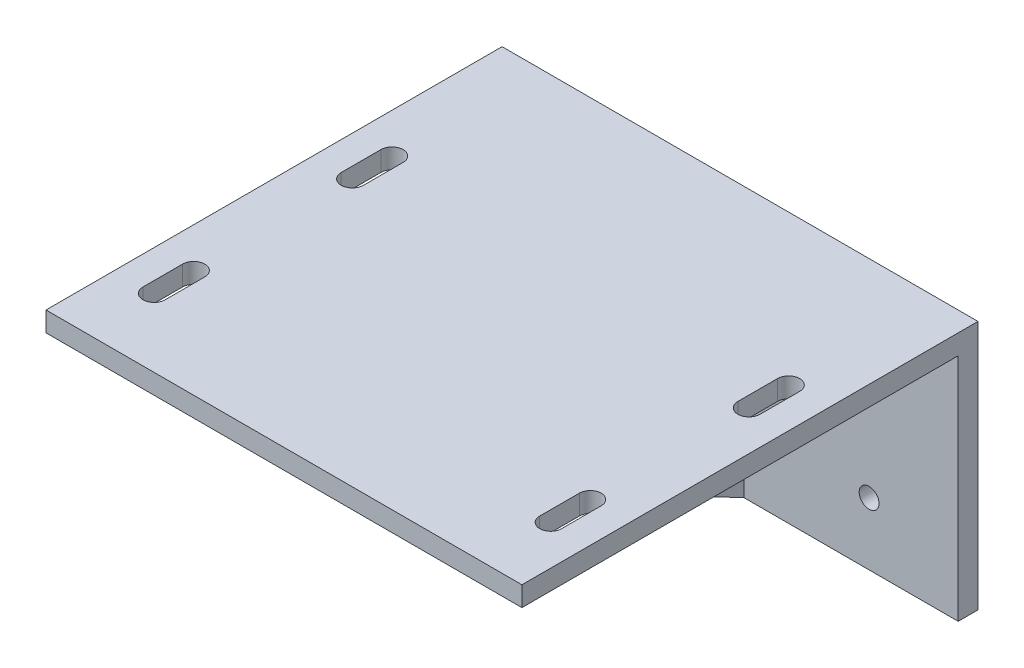
ISO-10303-21;
HEADER;
FILE_DESCRIPTION(('STEP AP214'),'2;1');
FILE_NAME('part.step','',(''),(''),'','','');
FILE_SCHEMA(('AUTOMOTIVE_DESIGN { 1 0 10303 214 1 1 1 1 }'));
ENDSEC;
DATA;
#1=APPLICATION_CONTEXT('core data for automotive mechanical design processes');
#2=APPLICATION_PROTOCOL_DEFINITION('international standard','automotive_design',2000,#1);
#3=PRODUCT_CONTEXT('',#1,'mechanical');
#4=PRODUCT('Part','Part','',(#3));
#5=PRODUCT_RELATED_PRODUCT_CATEGORY('part','',(#4));
#6=PRODUCT_DEFINITION_FORMATION('','',#4);
#7=PRODUCT_DEFINITION_CONTEXT('part definition',#1,'design');
#8=PRODUCT_DEFINITION('design','',#6,#7);
#9=PRODUCT_DEFINITION_SHAPE('','',#8);
#10=(LENGTH_UNIT() NAMED_UNIT(*) SI_UNIT(.MILLI.,.METRE.));
#11=(NAMED_UNIT(*) PLANE_ANGLE_UNIT() SI_UNIT($,.RADIAN.));
#12=(NAMED_UNIT(*) SI_UNIT($,.STERADIAN.) SOLID_ANGLE_UNIT());
#13=UNCERTAINTY_MEASURE_WITH_UNIT(LENGTH_MEASURE(1.E-05),#10,'distance_accuracy_value','');
#14=(GEOMETRIC_REPRESENTATION_CONTEXT(3) GLOBAL_UNCERTAINTY_ASSIGNED_CONTEXT((#13)) GLOBAL_UNIT_ASSIGNED_CONTEXT((#10,
#11,#12)) REPRESENTATION_CONTEXT('',''));
#15=CARTESIAN_POINT('',(0.,0.,0.));
#16=DIRECTION('',(0.,0.,1.));
#17=DIRECTION('',(1.,0.,0.));
#18=AXIS2_PLACEMENT_3D('',#15,#16,#17);
#19=CARTESIAN_POINT('',(-20.139723183391,-57.449446366782,146.05));
#20=DIRECTION('',(1.,0.,0.));
#21=DIRECTION('',(0.,0.,-1.));
#22=AXIS2_PLACEMENT_3D('',#19,#20,#21);
#23=PLANE('',#22);
#24=DIRECTION('',(0.,-0.466359614987067,-0.884595223539623));
#25=VECTOR('',#24,1.);
#26=CARTESIAN_POINT('',(-20.139723183391,16.210553633218,146.05));
#27=LINE('',#26,#25);
#28=CARTESIAN_POINT('',(-20.139723183391,16.210553633218,146.05));
#29=VERTEX_POINT('',#28);
#30=CARTESIAN_POINT('',(-20.139723183391,-57.444446366782,6.35));
#31=VERTEX_POINT('',#30);
#32=EDGE_CURVE('E213',#29,#31,#27,.T.);
#33=ORIENTED_EDGE('',*,*,#32,.F.);
#34=DIRECTION('',(0.,0.,-1.));
#35=VECTOR('',#34,1.);
#36=CARTESIAN_POINT('',(-20.139723183391,16.210553633218,146.05));
#37=LINE('',#36,#35);
#38=CARTESIAN_POINT('',(-20.139723183391,16.210553633218,6.34999999999999));
#39=VERTEX_POINT('',#38);
#40=EDGE_CURVE('E218',#29,#39,#37,.T.);
#41=ORIENTED_EDGE('',*,*,#40,.T.);
#42=DIRECTION('',(0.,1.,0.));
#43=VECTOR('',#42,1.);
#44=CARTESIAN_POINT('',(-20.139723183391,0.,6.35));
#45=LINE('',#44,#43);
#46=EDGE_CURVE('E221',#31,#39,#45,.T.);
#47=ORIENTED_EDGE('',*,*,#46,.F.);
#48=EDGE_LOOP('',(#33,#41,#47));
#49=FACE_BOUND('',#48,.T.);
#50=ADVANCED_FACE('F50',(#49),#23,.F.);
#51=CARTESIAN_POINT('',(-88.719723183391,16.210553633218,146.05));
#52=DIRECTION('',(0.,1.,0.));
#53=DIRECTION('',(0.,0.,1.));
#54=AXIS2_PLACEMENT_3D('',#51,#52,#53);
#55=PLANE('',#54);
#56=DIRECTION('',(0.,0.,1.));
#57=VECTOR('',#56,1.);
#58=CARTESIAN_POINT('',(-79.575723183391,16.210553633218,146.05));
#59=LINE('',#58,#57);
#60=CARTESIAN_POINT('',(-79.575723183391,16.210553633218,111.449496373036));
#61=VERTEX_POINT('',#60);
#62=CARTESIAN_POINT('',(-79.575723183391,16.210553633218,124.149496373036));
#63=VERTEX_POINT('',#62);
#64=EDGE_CURVE('E370',#61,#63,#59,.T.);
#65=ORIENTED_EDGE('',*,*,#64,.T.);
#66=CARTESIAN_POINT('',(-76.019723183391,16.210553633218,124.149496373036));
#67=DIRECTION('',(0.,1.,0.));
#68=DIRECTION('',(0.,0.,1.));
#69=AXIS2_PLACEMENT_3D('',#66,#67,#68);
#70=CIRCLE('',#69,3.556);
#71=CARTESIAN_POINT('',(-72.463723183391,16.210553633218,124.149496373036));
#72=VERTEX_POINT('',#71);
#73=EDGE_CURVE('E361',#63,#72,#70,.T.);
#74=ORIENTED_EDGE('',*,*,#73,.T.);
#75=DIRECTION('',(0.,0.,-1.));
#76=VECTOR('',#75,1.);
#77=CARTESIAN_POINT('',(-72.463723183391,16.210553633218,146.05));
#78=LINE('',#77,#76);
#79=CARTESIAN_POINT('',(-72.463723183391,16.210553633218,111.449496373036));
#80=VERTEX_POINT('',#79);
#81=EDGE_CURVE('E374',#72,#80,#78,.T.);
#82=ORIENTED_EDGE('',*,*,#81,.T.);
#83=CARTESIAN_POINT('',(-76.019723183391,16.210553633218,111.449496373036));
#84=DIRECTION('',(0.,1.,0.));
#85=DIRECTION('',(0.,0.,1.));
#86=AXIS2_PLACEMENT_3D('',#83,#84,#85);
#87=CIRCLE('',#86,3.556);
#88=EDGE_CURVE('E371',#80,#61,#87,.T.);
#89=ORIENTED_EDGE('',*,*,#88,.T.);
#90=EDGE_LOOP('',(#65,#74,#82,#89));
#91=FACE_BOUND('',#90,.T.);
#92=DIRECTION('',(0.,0.,1.));
#93=VECTOR('',#92,1.);
#94=CARTESIAN_POINT('',(-79.575723183391,16.210553633218,146.05));
#95=LINE('',#94,#93);
#96=CARTESIAN_POINT('',(-79.575723183391,16.210553633218,47.9494963730361));
#97=VERTEX_POINT('',#96);
#98=CARTESIAN_POINT('',(-79.575723183391,16.210553633218,60.6494963730361));
#99=VERTEX_POINT('',#98);
#100=EDGE_CURVE('E353',#97,#99,#95,.T.);
#101=ORIENTED_EDGE('',*,*,#100,.T.);
#102=CARTESIAN_POINT('',(-76.019723183391,16.210553633218,60.6494963730361));
#103=DIRECTION('',(0.,1.,0.));
#104=DIRECTION('',(0.,0.,1.));
#105=AXIS2_PLACEMENT_3D('',#102,#103,#104);
#106=CIRCLE('',#105,3.556);
#107=CARTESIAN_POINT('',(-72.463723183391,16.210553633218,60.6494963730361));
#108=VERTEX_POINT('',#107);
#109=EDGE_CURVE('E350',#99,#108,#106,.T.);
#110=ORIENTED_EDGE('',*,*,#109,.T.);
#111=DIRECTION('',(0.,0.,-1.));
#112=VECTOR('',#111,1.);
#113=CARTESIAN_POINT('',(-72.463723183391,16.210553633218,146.05));
#114=LINE('',#113,#112);
#115=CARTESIAN_POINT('',(-72.463723183391,16.210553633218,47.9494963730361));
#116=VERTEX_POINT('',#115);
#117=EDGE_CURVE('E356',#108,#116,#114,.T.);
#118=ORIENTED_EDGE('',*,*,#117,.T.);
#119=CARTESIAN_POINT('',(-76.019723183391,16.210553633218,47.9494963730361));
#120=DIRECTION('',(0.,1.,0.));
#121=DIRECTION('',(0.,0.,1.));
#122=AXIS2_PLACEMENT_3D('',#119,#120,#121);
#123=CIRCLE('',#122,3.556);
#124=EDGE_CURVE('E352',#116,#97,#123,.T.);
#125=ORIENTED_EDGE('',*,*,#124,.T.);
#126=EDGE_LOOP('',(#101,#110,#118,#125));
#127=FACE_BOUND('',#126,.T.);
#128=ORIENTED_EDGE('',*,*,#40,.F.);
#129=DIRECTION('',(1.,0.,0.));
#130=VECTOR('',#129,1.);
#131=CARTESIAN_POINT('',(-88.719723183391,16.210553633218,146.05));
#132=LINE('',#131,#130);
#133=CARTESIAN_POINT('',(-88.719723183391,16.210553633218,146.05));
#134=VERTEX_POINT('',#133);
#135=EDGE_CURVE('E232',#134,#29,#132,.T.);
#136=ORIENTED_EDGE('',*,*,#135,.F.);
#137=DIRECTION('',(0.,0.,-1.));
#138=VECTOR('',#137,1.);
#139=CARTESIAN_POINT('',(-88.719723183391,16.210553633218,146.05));
#140=LINE('',#139,#138);
#141=CARTESIAN_POINT('',(-88.719723183391,16.210553633218,6.35));
#142=VERTEX_POINT('',#141);
#143=EDGE_CURVE('E263',#134,#142,#140,.T.);
#144=ORIENTED_EDGE('',*,*,#143,.T.);
#145=DIRECTION('',(1.,0.,0.));
#146=VECTOR('',#145,1.);
#147=CARTESIAN_POINT('',(-88.719723183391,16.210553633218,6.35));
#148=LINE('',#147,#146);
#149=EDGE_CURVE('E234',#142,#39,#148,.T.);
#150=ORIENTED_EDGE('',*,*,#149,.T.);
#151=EDGE_LOOP('',(#128,#136,#144,#150));
#152=FACE_BOUND('',#151,.T.);
#153=ADVANCED_FACE('F229',(#91,#127,#152),#55,.F.);
#154=DIRECTION('',(0.,0.,1.));
#155=VECTOR('',#154,1.);
#156=CARTESIAN_POINT('',(47.4242768166091,16.210553633218,146.05));
#157=LINE('',#156,#155);
#158=CARTESIAN_POINT('',(47.424276816609,16.210553633218,47.9494963730361));
#159=VERTEX_POINT('',#158);
#160=CARTESIAN_POINT('',(47.424276816609,16.210553633218,60.6494963730361));
#161=VERTEX_POINT('',#160);
#162=EDGE_CURVE('E333',#159,#161,#157,.T.);
#163=ORIENTED_EDGE('',*,*,#162,.T.);
#164=CARTESIAN_POINT('',(50.980276816609,16.210553633218,60.6494963730361));
#165=DIRECTION('',(0.,1.,0.));
#166=DIRECTION('',(0.,0.,1.));
#167=AXIS2_PLACEMENT_3D('',#164,#165,#166);
#168=CIRCLE('',#167,3.55599999999999);
#169=CARTESIAN_POINT('',(54.536276816609,16.210553633218,60.6494963730361));
#170=VERTEX_POINT('',#169);
#171=EDGE_CURVE('E332',#161,#170,#168,.T.);
#172=ORIENTED_EDGE('',*,*,#171,.T.);
#173=DIRECTION('',(0.,0.,-1.));
#174=VECTOR('',#173,1.);
#175=CARTESIAN_POINT('',(54.5362768166089,16.210553633218,146.05));
#176=LINE('',#175,#174);
#177=CARTESIAN_POINT('',(54.536276816609,16.210553633218,47.9494963730361));
#178=VERTEX_POINT('',#177);
#179=EDGE_CURVE('E344',#170,#178,#176,.T.);
#180=ORIENTED_EDGE('',*,*,#179,.T.);
#181=CARTESIAN_POINT('',(50.980276816609,16.210553633218,47.9494963730361));
#182=DIRECTION('',(0.,1.,0.));
#183=DIRECTION('',(0.,0.,1.));
#184=AXIS2_PLACEMENT_3D('',#181,#182,#183);
#185=CIRCLE('',#184,3.556);
#186=EDGE_CURVE('E339',#178,#159,#185,.T.);
#187=ORIENTED_EDGE('',*,*,#186,.T.);
#188=EDGE_LOOP('',(#163,#172,#180,#187));
#189=FACE_BOUND('',#188,.T.);
#190=DIRECTION('',(0.,0.,1.));
#191=VECTOR('',#190,1.);
#192=CARTESIAN_POINT('',(47.4808979164753,16.210553633218,146.05));
#193=LINE('',#192,#191);
#194=CARTESIAN_POINT('',(47.4808979164753,16.210553633218,111.449496373036));
#195=VERTEX_POINT('',#194);
#196=CARTESIAN_POINT('',(47.4808979164753,16.210553633218,124.149496373036));
#197=VERTEX_POINT('',#196);
#198=EDGE_CURVE('E317',#195,#197,#193,.T.);
#199=ORIENTED_EDGE('',*,*,#198,.T.);
#200=CARTESIAN_POINT('',(50.980276816609,16.210553633218,124.149496373036));
#201=DIRECTION('',(0.,1.,0.));
#202=DIRECTION('',(0.,0.,1.));
#203=AXIS2_PLACEMENT_3D('',#200,#201,#202);
#204=CIRCLE('',#203,3.49937890013366);
#205=CARTESIAN_POINT('',(54.4796557167427,16.210553633218,124.149496373036));
#206=VERTEX_POINT('',#205);
#207=EDGE_CURVE('E59',#197,#206,#204,.T.);
#208=ORIENTED_EDGE('',*,*,#207,.T.);
#209=DIRECTION('',(0.,0.,-1.));
#210=VECTOR('',#209,1.);
#211=CARTESIAN_POINT('',(54.4796557167427,16.210553633218,146.05));
#212=LINE('',#211,#210);
#213=CARTESIAN_POINT('',(54.4796557167427,16.210553633218,111.449496373036));
#214=VERTEX_POINT('',#213);
#215=EDGE_CURVE('E330',#206,#214,#212,.T.);
#216=ORIENTED_EDGE('',*,*,#215,.T.);
#217=CARTESIAN_POINT('',(50.980276816609,16.210553633218,111.449496373036));
#218=DIRECTION('',(0.,1.,0.));
#219=DIRECTION('',(0.,0.,1.));
#220=AXIS2_PLACEMENT_3D('',#217,#218,#219);
#221=CIRCLE('',#220,3.49937890013366);
#222=EDGE_CURVE('E323',#214,#195,#221,.T.);
#223=ORIENTED_EDGE('',*,*,#222,.T.);
#224=EDGE_LOOP('',(#199,#208,#216,#223));
#225=FACE_BOUND('',#224,.T.);
#226=DIRECTION('',(0.,0.,1.));
#227=VECTOR('',#226,1.);
#228=CARTESIAN_POINT('',(-4.89972318339101,16.210553633218,146.05));
#229=LINE('',#228,#227);
#230=CARTESIAN_POINT('',(-4.89972318339099,16.210553633218,6.34999999999999));
#231=VERTEX_POINT('',#230);
#232=CARTESIAN_POINT('',(-4.89972318339098,16.210553633218,146.05));
#233=VERTEX_POINT('',#232);
#234=EDGE_CURVE('E233',#231,#233,#229,.T.);
#235=ORIENTED_EDGE('',*,*,#234,.F.);
#236=CARTESIAN_POINT('',(63.680276816609,16.210553633218,6.35));
#237=VERTEX_POINT('',#236);
#238=EDGE_CURVE('E259',#231,#237,#148,.T.);
#239=ORIENTED_EDGE('',*,*,#238,.T.);
#240=DIRECTION('',(0.,0.,-1.));
#241=VECTOR('',#240,1.);
#242=CARTESIAN_POINT('',(63.680276816609,16.210553633218,146.05));
#243=LINE('',#242,#241);
#244=CARTESIAN_POINT('',(63.680276816609,16.210553633218,146.05));
#245=VERTEX_POINT('',#244);
#246=EDGE_CURVE('E258',#245,#237,#243,.T.);
#247=ORIENTED_EDGE('',*,*,#246,.F.);
#248=EDGE_CURVE('E244',#233,#245,#132,.T.);
#249=ORIENTED_EDGE('',*,*,#248,.F.);
#250=EDGE_LOOP('',(#235,#239,#247,#249));
#251=FACE_BOUND('',#250,.T.);
#252=ADVANCED_FACE('F634',(#189,#225,#251),#55,.F.);
#253=CARTESIAN_POINT('',(0.,0.,6.35));
#254=DIRECTION('',(0.,0.,1.));
#255=DIRECTION('',(1.,0.,0.));
#256=AXIS2_PLACEMENT_3D('',#253,#254,#255);
#257=PLANE('',#256);
#258=CARTESIAN_POINT('',(-79.1468470478863,2.56055363321799,6.35));
#259=DIRECTION('',(0.,0.,1.));
#260=DIRECTION('',(1.,0.,0.));
#261=AXIS2_PLACEMENT_3D('',#258,#259,#260);
#262=CIRCLE('',#261,3.175);
#263=CARTESIAN_POINT('',(-75.9718470478863,2.56055363321799,6.35));
#264=VERTEX_POINT('',#263);
#265=EDGE_CURVE('E292',#264,#264,#262,.T.);
#266=ORIENTED_EDGE('',*,*,#265,.F.);
#267=EDGE_LOOP('',(#266));
#268=FACE_BOUND('',#267,.T.);
#269=CARTESIAN_POINT('',(-79.1468470478863,-37.439446366782,6.35));
#270=DIRECTION('',(0.,0.,1.));
#271=DIRECTION('',(1.,0.,0.));
#272=AXIS2_PLACEMENT_3D('',#269,#270,#271);
#273=CIRCLE('',#272,3.175);
#274=CARTESIAN_POINT('',(-75.9718470478863,-37.439446366782,6.35));
#275=VERTEX_POINT('',#274);
#276=EDGE_CURVE('E281',#275,#275,#273,.T.);
#277=ORIENTED_EDGE('',*,*,#276,.F.);
#278=EDGE_LOOP('',(#277));
#279=FACE_BOUND('',#278,.T.);
#280=DIRECTION('',(1.,0.,0.));
#281=VECTOR('',#280,1.);
#282=CARTESIAN_POINT('',(-88.719723183391,-57.439446366782,6.35));
#283=LINE('',#282,#281);
#284=CARTESIAN_POINT('',(-88.719723183391,-57.439446366782,6.35));
#285=VERTEX_POINT('',#284);
#286=EDGE_CURVE('E313',#285,#31,#283,.T.);
#287=ORIENTED_EDGE('',*,*,#286,.T.);
#288=ORIENTED_EDGE('',*,*,#46,.T.);
#289=ORIENTED_EDGE('',*,*,#149,.F.);
#290=DIRECTION('',(0.,-1.,0.));
#291=VECTOR('',#290,1.);
#292=CARTESIAN_POINT('',(-88.719723183391,22.560553633218,6.35));
#293=LINE('',#292,#291);
#294=EDGE_CURVE('E299',#142,#285,#293,.T.);
#295=ORIENTED_EDGE('',*,*,#294,.T.);
#296=EDGE_LOOP('',(#287,#288,#289,#295));
#297=FACE_BOUND('',#296,.T.);
#298=ADVANCED_FACE('F418',(#268,#279,#297),#257,.T.);
#299=CARTESIAN_POINT('',(35.1531529521137,-37.439446366782,6.35));
#300=DIRECTION('',(0.,0.,1.));
#301=DIRECTION('',(1.,0.,0.));
#302=AXIS2_PLACEMENT_3D('',#299,#300,#301);
#303=CIRCLE('',#302,3.175);
#304=CARTESIAN_POINT('',(38.3281529521137,-37.439446366782,6.35));
#305=VERTEX_POINT('',#304);
#306=EDGE_CURVE('E270',#305,#305,#303,.T.);
#307=ORIENTED_EDGE('',*,*,#306,.F.);
#308=EDGE_LOOP('',(#307));
#309=FACE_BOUND('',#308,.T.);
#310=CARTESIAN_POINT('',(35.1531529521137,2.56055363321799,6.35));
#311=DIRECTION('',(0.,0.,1.));
#312=DIRECTION('',(1.,0.,0.));
#313=AXIS2_PLACEMENT_3D('',#310,#311,#312);
#314=CIRCLE('',#313,3.17500000000001);
#315=CARTESIAN_POINT('',(38.3281529521137,2.56055363321799,6.35));
#316=VERTEX_POINT('',#315);
#317=EDGE_CURVE('E274',#316,#316,#314,.T.);
#318=ORIENTED_EDGE('',*,*,#317,.F.);
#319=EDGE_LOOP('',(#318));
#320=FACE_BOUND('',#319,.T.);
#321=ORIENTED_EDGE('',*,*,#238,.F.);
#322=DIRECTION('',(0.,-1.,0.));
#323=VECTOR('',#322,1.);
#324=CARTESIAN_POINT('',(-4.89972318339099,0.,6.35));
#325=LINE('',#324,#323);
#326=CARTESIAN_POINT('',(-4.89972318339101,-57.441946366782,6.34999999999999));
#327=VERTEX_POINT('',#326);
#328=EDGE_CURVE('E535',#231,#327,#325,.T.);
#329=ORIENTED_EDGE('',*,*,#328,.T.);
#330=CARTESIAN_POINT('',(63.680301816609,-57.439446366782,6.35000000000008));
#331=VERTEX_POINT('',#330);
#332=EDGE_CURVE('E305',#327,#331,#283,.T.);
#333=ORIENTED_EDGE('',*,*,#332,.T.);
#334=DIRECTION('',(0.,1.,0.));
#335=VECTOR('',#334,1.);
#336=CARTESIAN_POINT('',(63.680276816609,22.560553633218,6.35));
#337=LINE('',#336,#335);
#338=EDGE_CURVE('E312',#331,#237,#337,.T.);
#339=ORIENTED_EDGE('',*,*,#338,.T.);
#340=EDGE_LOOP('',(#321,#329,#333,#339));
#341=FACE_BOUND('',#340,.T.);
#342=ADVANCED_FACE('F653',(#309,#320,#341),#257,.T.);
#343=CARTESIAN_POINT('',(0.,0.,0.));
#344=DIRECTION('',(0.,0.,1.));
#345=DIRECTION('',(1.,0.,0.));
#346=AXIS2_PLACEMENT_3D('',#343,#344,#345);
#347=PLANE('',#346);
#348=DIRECTION('',(0.,-1.,0.));
#349=VECTOR('',#348,1.);
#350=CARTESIAN_POINT('',(-88.719723183391,22.560553633218,0.));
#351=LINE('',#350,#349);
#352=CARTESIAN_POINT('',(-88.719723183391,22.560553633218,0.));
#353=VERTEX_POINT('',#352);
#354=CARTESIAN_POINT('',(-88.719723183391,-57.439446366782,0.));
#355=VERTEX_POINT('',#354);
#356=EDGE_CURVE('E293',#353,#355,#351,.T.);
#357=ORIENTED_EDGE('',*,*,#356,.F.);
#358=DIRECTION('',(-1.,0.,0.));
#359=VECTOR('',#358,1.);
#360=CARTESIAN_POINT('',(-88.719723183391,22.560553633218,0.));
#361=LINE('',#360,#359);
#362=CARTESIAN_POINT('',(63.680276816609,22.560553633218,0.));
#363=VERTEX_POINT('',#362);
#364=EDGE_CURVE('E304',#363,#353,#361,.T.);
#365=ORIENTED_EDGE('',*,*,#364,.F.);
#366=DIRECTION('',(0.,1.,0.));
#367=VECTOR('',#366,1.);
#368=CARTESIAN_POINT('',(63.680276816609,22.560553633218,0.));
#369=LINE('',#368,#367);
#370=CARTESIAN_POINT('',(63.680276816609,-57.439446366782,0.));
#371=VERTEX_POINT('',#370);
#372=EDGE_CURVE('E394',#371,#363,#369,.T.);
#373=ORIENTED_EDGE('',*,*,#372,.F.);
#374=DIRECTION('',(1.,0.,0.));
#375=VECTOR('',#374,1.);
#376=CARTESIAN_POINT('',(-88.719723183391,-57.439446366782,0.));
#377=LINE('',#376,#375);
#378=EDGE_CURVE('E397',#355,#371,#377,.T.);
#379=ORIENTED_EDGE('',*,*,#378,.F.);
#380=EDGE_LOOP('',(#357,#365,#373,#379));
#381=FACE_BOUND('',#380,.T.);
#382=CARTESIAN_POINT('',(-79.1468470478863,2.56055363321799,0.));
#383=DIRECTION('',(0.,0.,1.));
#384=DIRECTION('',(1.,0.,0.));
#385=AXIS2_PLACEMENT_3D('',#382,#383,#384);
#386=CIRCLE('',#385,3.175);
#387=CARTESIAN_POINT('',(-75.9718470478863,2.56055363321799,0.));
#388=VERTEX_POINT('',#387);
#389=EDGE_CURVE('E290',#388,#388,#386,.T.);
#390=ORIENTED_EDGE('',*,*,#389,.T.);
#391=EDGE_LOOP('',(#390));
#392=FACE_BOUND('',#391,.T.);
#393=CARTESIAN_POINT('',(-79.1468470478863,-37.439446366782,0.));
#394=DIRECTION('',(0.,0.,1.));
#395=DIRECTION('',(1.,0.,0.));
#396=AXIS2_PLACEMENT_3D('',#393,#394,#395);
#397=CIRCLE('',#396,3.175);
#398=CARTESIAN_POINT('',(-75.9718470478863,-37.439446366782,0.));
#399=VERTEX_POINT('',#398);
#400=EDGE_CURVE('E276',#399,#399,#397,.T.);
#401=ORIENTED_EDGE('',*,*,#400,.T.);
#402=EDGE_LOOP('',(#401));
#403=FACE_BOUND('',#402,.T.);
#404=CARTESIAN_POINT('',(35.1531529521137,2.56055363321799,0.));
#405=DIRECTION('',(0.,0.,1.));
#406=DIRECTION('',(1.,0.,0.));
#407=AXIS2_PLACEMENT_3D('',#404,#405,#406);
#408=CIRCLE('',#407,3.17500000000001);
#409=CARTESIAN_POINT('',(38.3281529521137,2.56055363321799,0.));
#410=VERTEX_POINT('',#409);
#411=EDGE_CURVE('E271',#410,#410,#408,.T.);
#412=ORIENTED_EDGE('',*,*,#411,.T.);
#413=EDGE_LOOP('',(#412));
#414=FACE_BOUND('',#413,.T.);
#415=CARTESIAN_POINT('',(35.1531529521137,-37.439446366782,0.));
#416=DIRECTION('',(0.,0.,1.));
#417=DIRECTION('',(1.,0.,0.));
#418=AXIS2_PLACEMENT_3D('',#415,#416,#417);
#419=CIRCLE('',#418,3.175);
#420=CARTESIAN_POINT('',(38.3281529521137,-37.439446366782,0.));
#421=VERTEX_POINT('',#420);
#422=EDGE_CURVE('E266',#421,#421,#419,.T.);
#423=ORIENTED_EDGE('',*,*,#422,.T.);
#424=EDGE_LOOP('',(#423));
#425=FACE_BOUND('',#424,.T.);
#426=ADVANCED_FACE('F409',(#381,#392,#403,#414,#425),#347,.F.);
#427=CARTESIAN_POINT('',(-88.719723183391,22.560553633218,6.35));
#428=DIRECTION('',(1.,0.,0.));
#429=DIRECTION('',(0.,0.,-1.));
#430=AXIS2_PLACEMENT_3D('',#427,#428,#429);
#431=PLANE('',#430);
#432=ORIENTED_EDGE('',*,*,#356,.T.);
#433=DIRECTION('',(0.,0.,-1.));
#434=VECTOR('',#433,1.);
#435=CARTESIAN_POINT('',(-88.719723183391,-57.439446366782,6.35));
#436=LINE('',#435,#434);
#437=EDGE_CURVE('E377',#285,#355,#436,.T.);
#438=ORIENTED_EDGE('',*,*,#437,.F.);
#439=ORIENTED_EDGE('',*,*,#294,.F.);
#440=ORIENTED_EDGE('',*,*,#143,.F.);
#441=DIRECTION('',(0.,-1.,0.));
#442=VECTOR('',#441,1.);
#443=CARTESIAN_POINT('',(-88.719723183391,22.560553633218,146.05));
#444=LINE('',#443,#442);
#445=CARTESIAN_POINT('',(-88.719723183391,22.560553633218,146.05));
#446=VERTEX_POINT('',#445);
#447=EDGE_CURVE('E238',#446,#134,#444,.T.);
#448=ORIENTED_EDGE('',*,*,#447,.F.);
#449=DIRECTION('',(0.,0.,-1.));
#450=VECTOR('',#449,1.);
#451=CARTESIAN_POINT('',(-88.719723183391,22.560553633218,6.35));
#452=LINE('',#451,#450);
#453=EDGE_CURVE('E389',#446,#353,#452,.T.);
#454=ORIENTED_EDGE('',*,*,#453,.T.);
#455=EDGE_LOOP('',(#432,#438,#439,#440,#448,#454));
#456=FACE_BOUND('',#455,.T.);
#457=ADVANCED_FACE('F47',(#456),#431,.F.);
#458=CARTESIAN_POINT('',(-88.719723183391,-57.439446366782,6.35));
#459=DIRECTION('',(0.,1.,0.));
#460=DIRECTION('',(0.,0.,1.));
#461=AXIS2_PLACEMENT_3D('',#458,#459,#460);
#462=PLANE('',#461);
#463=CARTESIAN_POINT('',(-20.139723183391,-57.439446366782,6.34999999999997));
#464=DIRECTION('',(1.,0.,0.));
#465=VECTOR('',#464,1.);
#466=LINE('',#463,#465);
#467=EDGE_CURVE('E67',#31,#327,#466,.T.);
#468=ORIENTED_EDGE('',*,*,#467,.F.);
#469=ORIENTED_EDGE('',*,*,#286,.F.);
#470=ORIENTED_EDGE('',*,*,#437,.T.);
#471=ORIENTED_EDGE('',*,*,#378,.T.);
#472=DIRECTION('',(0.,0.,-1.));
#473=VECTOR('',#472,1.);
#474=CARTESIAN_POINT('',(63.680276816609,-57.439446366782,6.35));
#475=LINE('',#474,#473);
#476=EDGE_CURVE('E382',#331,#371,#475,.T.);
#477=ORIENTED_EDGE('',*,*,#476,.F.);
#478=ORIENTED_EDGE('',*,*,#332,.F.);
#479=EDGE_LOOP('',(#468,#469,#470,#471,#477,#478));
#480=FACE_BOUND('',#479,.T.);
#481=ADVANCED_FACE('F414',(#480),#462,.F.);
#482=CARTESIAN_POINT('',(63.680276816609,22.560553633218,6.35));
#483=DIRECTION('',(-1.,0.,0.));
#484=DIRECTION('',(0.,0.,1.));
#485=AXIS2_PLACEMENT_3D('',#482,#483,#484);
#486=PLANE('',#485);
#487=ORIENTED_EDGE('',*,*,#372,.T.);
#488=DIRECTION('',(0.,0.,-1.));
#489=VECTOR('',#488,1.);
#490=CARTESIAN_POINT('',(63.680276816609,22.560553633218,6.35));
#491=LINE('',#490,#489);
#492=CARTESIAN_POINT('',(63.680276816609,22.560553633218,146.05));
#493=VERTEX_POINT('',#492);
#494=EDGE_CURVE('E383',#493,#363,#491,.T.);
#495=ORIENTED_EDGE('',*,*,#494,.F.);
#496=DIRECTION('',(0.,1.,0.));
#497=VECTOR('',#496,1.);
#498=CARTESIAN_POINT('',(63.680276816609,22.560553633218,146.05));
#499=LINE('',#498,#497);
#500=EDGE_CURVE('E241',#245,#493,#499,.T.);
#501=ORIENTED_EDGE('',*,*,#500,.F.);
#502=ORIENTED_EDGE('',*,*,#246,.T.);
#503=ORIENTED_EDGE('',*,*,#338,.F.);
#504=ORIENTED_EDGE('',*,*,#476,.T.);
#505=EDGE_LOOP('',(#487,#495,#501,#502,#503,#504));
#506=FACE_BOUND('',#505,.T.);
#507=ADVANCED_FACE('F658',(#506),#486,.F.);
#508=CARTESIAN_POINT('',(-88.719723183391,22.560553633218,6.35));
#509=DIRECTION('',(0.,-1.,0.));
#510=DIRECTION('',(0.,0.,-1.));
#511=AXIS2_PLACEMENT_3D('',#508,#509,#510);
#512=PLANE('',#511);
#513=DIRECTION('',(0.,0.,-1.));
#514=VECTOR('',#513,1.);
#515=CARTESIAN_POINT('',(54.4796557167427,22.560553633218,124.149496373036));
#516=LINE('',#515,#514);
#517=CARTESIAN_POINT('',(54.4796557167427,22.560553633218,124.149496373036));
#518=VERTEX_POINT('',#517);
#519=CARTESIAN_POINT('',(54.4796557167427,22.560553633218,111.449496373036));
#520=VERTEX_POINT('',#519);
#521=EDGE_CURVE('E502',#518,#520,#516,.T.);
#522=ORIENTED_EDGE('',*,*,#521,.F.);
#523=CARTESIAN_POINT('',(50.980276816609,22.560553633218,124.149496373036));
#524=DIRECTION('',(0.,1.,0.));
#525=DIRECTION('',(0.,0.,1.));
#526=AXIS2_PLACEMENT_3D('',#523,#524,#525);
#527=CIRCLE('',#526,3.49937890013366);
#528=CARTESIAN_POINT('',(47.4808979164753,22.560553633218,124.149496373036));
#529=VERTEX_POINT('',#528);
#530=EDGE_CURVE('E505',#529,#518,#527,.T.);
#531=ORIENTED_EDGE('',*,*,#530,.F.);
#532=DIRECTION('',(0.,0.,1.));
#533=VECTOR('',#532,1.);
#534=CARTESIAN_POINT('',(47.4808979164753,22.560553633218,124.149496373036));
#535=LINE('',#534,#533);
#536=CARTESIAN_POINT('',(47.4808979164753,22.560553633218,111.449496373036));
#537=VERTEX_POINT('',#536);
#538=EDGE_CURVE('E511',#537,#529,#535,.T.);
#539=ORIENTED_EDGE('',*,*,#538,.F.);
#540=CARTESIAN_POINT('',(50.980276816609,22.560553633218,111.449496373036));
#541=DIRECTION('',(0.,1.,0.));
#542=DIRECTION('',(0.,0.,1.));
#543=AXIS2_PLACEMENT_3D('',#540,#541,#542);
#544=CIRCLE('',#543,3.49937890013366);
#545=EDGE_CURVE('E506',#520,#537,#544,.T.);
#546=ORIENTED_EDGE('',*,*,#545,.F.);
#547=EDGE_LOOP('',(#522,#531,#539,#546));
#548=FACE_BOUND('',#547,.T.);
#549=DIRECTION('',(0.,0.,-1.));
#550=VECTOR('',#549,1.);
#551=CARTESIAN_POINT('',(54.536276816609,22.560553633218,60.6494963730361));
#552=LINE('',#551,#550);
#553=CARTESIAN_POINT('',(54.536276816609,22.560553633218,60.6494963730361));
#554=VERTEX_POINT('',#553);
#555=CARTESIAN_POINT('',(54.536276816609,22.560553633218,47.9494963730361));
#556=VERTEX_POINT('',#555);
#557=EDGE_CURVE('E480',#554,#556,#552,.T.);
#558=ORIENTED_EDGE('',*,*,#557,.F.);
#559=CARTESIAN_POINT('',(50.980276816609,22.560553633218,60.6494963730361));
#560=DIRECTION('',(0.,1.,0.));
#561=DIRECTION('',(0.,0.,1.));
#562=AXIS2_PLACEMENT_3D('',#559,#560,#561);
#563=CIRCLE('',#562,3.55599999999999);
#564=CARTESIAN_POINT('',(47.424276816609,22.560553633218,60.6494963730361));
#565=VERTEX_POINT('',#564);
#566=EDGE_CURVE('E475',#565,#554,#563,.T.);
#567=ORIENTED_EDGE('',*,*,#566,.F.);
#568=DIRECTION('',(0.,0.,1.));
#569=VECTOR('',#568,1.);
#570=CARTESIAN_POINT('',(47.424276816609,22.560553633218,60.6494963730361));
#571=LINE('',#570,#569);
#572=CARTESIAN_POINT('',(47.424276816609,22.560553633218,47.9494963730361));
#573=VERTEX_POINT('',#572);
#574=EDGE_CURVE('E484',#573,#565,#571,.T.);
#575=ORIENTED_EDGE('',*,*,#574,.F.);
#576=CARTESIAN_POINT('',(50.980276816609,22.560553633218,47.9494963730361));
#577=DIRECTION('',(0.,1.,0.));
#578=DIRECTION('',(0.,0.,1.));
#579=AXIS2_PLACEMENT_3D('',#576,#577,#578);
#580=CIRCLE('',#579,3.556);
#581=EDGE_CURVE('E481',#556,#573,#580,.T.);
#582=ORIENTED_EDGE('',*,*,#581,.F.);
#583=EDGE_LOOP('',(#558,#567,#575,#582));
#584=FACE_BOUND('',#583,.T.);
#585=DIRECTION('',(0.,0.,-1.));
#586=VECTOR('',#585,1.);
#587=CARTESIAN_POINT('',(-72.463723183391,22.560553633218,60.6494963730361));
#588=LINE('',#587,#586);
#589=CARTESIAN_POINT('',(-72.463723183391,22.560553633218,60.6494963730361));
#590=VERTEX_POINT('',#589);
#591=CARTESIAN_POINT('',(-72.463723183391,22.560553633218,47.9494963730361));
#592=VERTEX_POINT('',#591);
#593=EDGE_CURVE('E449',#590,#592,#588,.T.);
#594=ORIENTED_EDGE('',*,*,#593,.F.);
#595=CARTESIAN_POINT('',(-76.019723183391,22.560553633218,60.6494963730361));
#596=DIRECTION('',(0.,1.,0.));
#597=DIRECTION('',(0.,0.,1.));
#598=AXIS2_PLACEMENT_3D('',#595,#596,#597);
#599=CIRCLE('',#598,3.556);
#600=CARTESIAN_POINT('',(-79.575723183391,22.560553633218,60.6494963730361));
#601=VERTEX_POINT('',#600);
#602=EDGE_CURVE('E448',#601,#590,#599,.T.);
#603=ORIENTED_EDGE('',*,*,#602,.F.);
#604=DIRECTION('',(0.,0.,1.));
#605=VECTOR('',#604,1.);
#606=CARTESIAN_POINT('',(-79.575723183391,22.560553633218,60.6494963730361));
#607=LINE('',#606,#605);
#608=CARTESIAN_POINT('',(-79.575723183391,22.560553633218,47.9494963730361));
#609=VERTEX_POINT('',#608);
#610=EDGE_CURVE('E460',#609,#601,#607,.T.);
#611=ORIENTED_EDGE('',*,*,#610,.F.);
#612=CARTESIAN_POINT('',(-76.019723183391,22.560553633218,47.9494963730361));
#613=DIRECTION('',(0.,1.,0.));
#614=DIRECTION('',(0.,0.,1.));
#615=AXIS2_PLACEMENT_3D('',#612,#613,#614);
#616=CIRCLE('',#615,3.556);
#617=EDGE_CURVE('E454',#592,#609,#616,.T.);
#618=ORIENTED_EDGE('',*,*,#617,.F.);
#619=EDGE_LOOP('',(#594,#603,#611,#618));
#620=FACE_BOUND('',#619,.T.);
#621=DIRECTION('',(0.,0.,-1.));
#622=VECTOR('',#621,1.);
#623=CARTESIAN_POINT('',(-72.463723183391,22.560553633218,124.149496373036));
#624=LINE('',#623,#622);
#625=CARTESIAN_POINT('',(-72.463723183391,22.560553633218,124.149496373036));
#626=VERTEX_POINT('',#625);
#627=CARTESIAN_POINT('',(-72.463723183391,22.560553633218,111.449496373036));
#628=VERTEX_POINT('',#627);
#629=EDGE_CURVE('E438',#626,#628,#624,.T.);
#630=ORIENTED_EDGE('',*,*,#629,.F.);
#631=CARTESIAN_POINT('',(-76.019723183391,22.560553633218,124.149496373036));
#632=DIRECTION('',(0.,1.,0.));
#633=DIRECTION('',(0.,0.,1.));
#634=AXIS2_PLACEMENT_3D('',#631,#632,#633);
#635=CIRCLE('',#634,3.556);
#636=CARTESIAN_POINT('',(-79.575723183391,22.560553633218,124.149496373036));
#637=VERTEX_POINT('',#636);
#638=EDGE_CURVE('E444',#637,#626,#635,.T.);
#639=ORIENTED_EDGE('',*,*,#638,.F.);
#640=DIRECTION('',(0.,0.,1.));
#641=VECTOR('',#640,1.);
#642=CARTESIAN_POINT('',(-79.575723183391,22.560553633218,124.149496373036));
#643=LINE('',#642,#641);
#644=CARTESIAN_POINT('',(-79.575723183391,22.560553633218,111.449496373036));
#645=VERTEX_POINT('',#644);
#646=EDGE_CURVE('E435',#645,#637,#643,.T.);
#647=ORIENTED_EDGE('',*,*,#646,.F.);
#648=CARTESIAN_POINT('',(-76.019723183391,22.560553633218,111.449496373036));
#649=DIRECTION('',(0.,1.,0.));
#650=DIRECTION('',(0.,0.,1.));
#651=AXIS2_PLACEMENT_3D('',#648,#649,#650);
#652=CIRCLE('',#651,3.556);
#653=EDGE_CURVE('E434',#628,#645,#652,.T.);
#654=ORIENTED_EDGE('',*,*,#653,.F.);
#655=EDGE_LOOP('',(#630,#639,#647,#654));
#656=FACE_BOUND('',#655,.T.);
#657=ORIENTED_EDGE('',*,*,#364,.T.);
#658=ORIENTED_EDGE('',*,*,#453,.F.);
#659=DIRECTION('',(-1.,0.,0.));
#660=VECTOR('',#659,1.);
#661=CARTESIAN_POINT('',(-88.719723183391,22.560553633218,146.05));
#662=LINE('',#661,#660);
#663=EDGE_CURVE('E246',#493,#446,#662,.T.);
#664=ORIENTED_EDGE('',*,*,#663,.F.);
#665=ORIENTED_EDGE('',*,*,#494,.T.);
#666=EDGE_LOOP('',(#657,#658,#664,#665));
#667=FACE_BOUND('',#666,.T.);
#668=ADVANCED_FACE('F647',(#548,#584,#620,#656,#667),#512,.F.);
#669=CARTESIAN_POINT('',(-79.1468470478863,2.56055363321799,6.35));
#670=DIRECTION('',(0.,0.,-1.));
#671=DIRECTION('',(-1.,0.,0.));
#672=AXIS2_PLACEMENT_3D('',#669,#670,#671);
#673=CYLINDRICAL_SURFACE('',#672,3.175);
#674=ORIENTED_EDGE('',*,*,#265,.T.);
#675=EDGE_LOOP('',(#674));
#676=FACE_BOUND('',#675,.T.);
#677=ORIENTED_EDGE('',*,*,#389,.F.);
#678=EDGE_LOOP('',(#677));
#679=FACE_BOUND('',#678,.T.);
#680=ADVANCED_FACE('F642',(#676,#679),#673,.F.);
#681=CARTESIAN_POINT('',(-79.1468470478863,-37.439446366782,6.35));
#682=DIRECTION('',(0.,0.,-1.));
#683=DIRECTION('',(-1.,0.,0.));
#684=AXIS2_PLACEMENT_3D('',#681,#682,#683);
#685=CYLINDRICAL_SURFACE('',#684,3.175);
#686=ORIENTED_EDGE('',*,*,#276,.T.);
#687=EDGE_LOOP('',(#686));
#688=FACE_BOUND('',#687,.T.);
#689=ORIENTED_EDGE('',*,*,#400,.F.);
#690=EDGE_LOOP('',(#689));
#691=FACE_BOUND('',#690,.T.);
#692=ADVANCED_FACE('F643',(#688,#691),#685,.F.);
#693=CARTESIAN_POINT('',(35.1531529521137,2.56055363321799,6.35));
#694=DIRECTION('',(0.,0.,-1.));
#695=DIRECTION('',(-1.,0.,0.));
#696=AXIS2_PLACEMENT_3D('',#693,#694,#695);
#697=CYLINDRICAL_SURFACE('',#696,3.17500000000001);
#698=ORIENTED_EDGE('',*,*,#317,.T.);
#699=EDGE_LOOP('',(#698));
#700=FACE_BOUND('',#699,.T.);
#701=ORIENTED_EDGE('',*,*,#411,.F.);
#702=EDGE_LOOP('',(#701));
#703=FACE_BOUND('',#702,.T.);
#704=ADVANCED_FACE('F637',(#700,#703),#697,.F.);
#705=CARTESIAN_POINT('',(35.1531529521137,-37.439446366782,6.35));
#706=DIRECTION('',(0.,0.,-1.));
#707=DIRECTION('',(-1.,0.,0.));
#708=AXIS2_PLACEMENT_3D('',#705,#706,#707);
#709=CYLINDRICAL_SURFACE('',#708,3.175);
#710=ORIENTED_EDGE('',*,*,#306,.T.);
#711=EDGE_LOOP('',(#710));
#712=FACE_BOUND('',#711,.T.);
#713=ORIENTED_EDGE('',*,*,#422,.F.);
#714=EDGE_LOOP('',(#713));
#715=FACE_BOUND('',#714,.T.);
#716=ADVANCED_FACE('F627',(#712,#715),#709,.F.);
#717=CARTESIAN_POINT('',(0.,0.,146.05));
#718=DIRECTION('',(0.,0.,1.));
#719=DIRECTION('',(1.,0.,0.));
#720=AXIS2_PLACEMENT_3D('',#717,#718,#719);
#721=PLANE('',#720);
#722=DIRECTION('',(-1.,0.,0.));
#723=VECTOR('',#722,1.);
#724=CARTESIAN_POINT('',(63.680301816609,16.210553633218,146.05));
#725=LINE('',#724,#723);
#726=EDGE_CURVE('E209',#233,#29,#725,.T.);
#727=ORIENTED_EDGE('',*,*,#726,.F.);
#728=ORIENTED_EDGE('',*,*,#248,.T.);
#729=ORIENTED_EDGE('',*,*,#500,.T.);
#730=ORIENTED_EDGE('',*,*,#663,.T.);
#731=ORIENTED_EDGE('',*,*,#447,.T.);
#732=ORIENTED_EDGE('',*,*,#135,.T.);
#733=EDGE_LOOP('',(#727,#728,#729,#730,#731,#732));
#734=FACE_BOUND('',#733,.T.);
#735=ADVANCED_FACE('F240',(#734),#721,.T.);
#736=CARTESIAN_POINT('',(-76.019723183391,-57.439446366782,124.149496373036));
#737=DIRECTION('',(0.,1.,0.));
#738=DIRECTION('',(0.,0.,1.));
#739=AXIS2_PLACEMENT_3D('',#736,#737,#738);
#740=CYLINDRICAL_SURFACE('',#739,3.556);
#741=DIRECTION('',(0.,1.,0.));
#742=VECTOR('',#741,1.);
#743=CARTESIAN_POINT('',(-79.575723183391,-57.439446366782,124.149496373036));
#744=LINE('',#743,#742);
#745=EDGE_CURVE('E419',#63,#637,#744,.T.);
#746=ORIENTED_EDGE('',*,*,#745,.T.);
#747=ORIENTED_EDGE('',*,*,#638,.T.);
#748=DIRECTION('',(0.,1.,0.));
#749=VECTOR('',#748,1.);
#750=CARTESIAN_POINT('',(-72.463723183391,-57.439446366782,124.149496373036));
#751=LINE('',#750,#749);
#752=EDGE_CURVE('E428',#72,#626,#751,.T.);
#753=ORIENTED_EDGE('',*,*,#752,.F.);
#754=ORIENTED_EDGE('',*,*,#73,.F.);
#755=EDGE_LOOP('',(#746,#747,#753,#754));
#756=FACE_BOUND('',#755,.T.);
#757=ADVANCED_FACE('F620',(#756),#740,.F.);
#758=CARTESIAN_POINT('',(-79.575723183391,-57.439446366782,124.149496373036));
#759=DIRECTION('',(-1.,0.,0.));
#760=DIRECTION('',(0.,0.,1.));
#761=AXIS2_PLACEMENT_3D('',#758,#759,#760);
#762=PLANE('',#761);
#763=DIRECTION('',(0.,1.,0.));
#764=VECTOR('',#763,1.);
#765=CARTESIAN_POINT('',(-79.575723183391,-57.439446366782,111.449496373036));
#766=LINE('',#765,#764);
#767=EDGE_CURVE('E425',#61,#645,#766,.T.);
#768=ORIENTED_EDGE('',*,*,#767,.T.);
#769=ORIENTED_EDGE('',*,*,#646,.T.);
#770=ORIENTED_EDGE('',*,*,#745,.F.);
#771=ORIENTED_EDGE('',*,*,#64,.F.);
#772=EDGE_LOOP('',(#768,#769,#770,#771));
#773=FACE_BOUND('',#772,.T.);
#774=ADVANCED_FACE('F611',(#773),#762,.F.);
#775=CARTESIAN_POINT('',(-76.019723183391,-57.439446366782,111.449496373036));
#776=DIRECTION('',(0.,1.,0.));
#777=DIRECTION('',(0.,0.,1.));
#778=AXIS2_PLACEMENT_3D('',#775,#776,#777);
#779=CYLINDRICAL_SURFACE('',#778,3.556);
#780=DIRECTION('',(0.,1.,0.));
#781=VECTOR('',#780,1.);
#782=CARTESIAN_POINT('',(-72.463723183391,-57.439446366782,111.449496373036));
#783=LINE('',#782,#781);
#784=EDGE_CURVE('E422',#80,#628,#783,.T.);
#785=ORIENTED_EDGE('',*,*,#784,.T.);
#786=ORIENTED_EDGE('',*,*,#653,.T.);
#787=ORIENTED_EDGE('',*,*,#767,.F.);
#788=ORIENTED_EDGE('',*,*,#88,.F.);
#789=EDGE_LOOP('',(#785,#786,#787,#788));
#790=FACE_BOUND('',#789,.T.);
#791=ADVANCED_FACE('F617',(#790),#779,.F.);
#792=CARTESIAN_POINT('',(-72.463723183391,-57.439446366782,124.149496373036));
#793=DIRECTION('',(1.,0.,0.));
#794=DIRECTION('',(0.,0.,-1.));
#795=AXIS2_PLACEMENT_3D('',#792,#793,#794);
#796=PLANE('',#795);
#797=ORIENTED_EDGE('',*,*,#752,.T.);
#798=ORIENTED_EDGE('',*,*,#629,.T.);
#799=ORIENTED_EDGE('',*,*,#784,.F.);
#800=ORIENTED_EDGE('',*,*,#81,.F.);
#801=EDGE_LOOP('',(#797,#798,#799,#800));
#802=FACE_BOUND('',#801,.T.);
#803=ADVANCED_FACE('F569',(#802),#796,.F.);
#804=CARTESIAN_POINT('',(-76.019723183391,-57.439446366782,60.6494963730361));
#805=DIRECTION('',(0.,1.,0.));
#806=DIRECTION('',(0.,0.,1.));
#807=AXIS2_PLACEMENT_3D('',#804,#805,#806);
#808=CYLINDRICAL_SURFACE('',#807,3.556);
#809=DIRECTION('',(0.,1.,0.));
#810=VECTOR('',#809,1.);
#811=CARTESIAN_POINT('',(-79.575723183391,-57.439446366782,60.6494963730361));
#812=LINE('',#811,#810);
#813=EDGE_CURVE('E473',#99,#601,#812,.T.);
#814=ORIENTED_EDGE('',*,*,#813,.T.);
#815=ORIENTED_EDGE('',*,*,#602,.T.);
#816=DIRECTION('',(0.,1.,0.));
#817=VECTOR('',#816,1.);
#818=CARTESIAN_POINT('',(-72.463723183391,-57.439446366782,60.6494963730361));
#819=LINE('',#818,#817);
#820=EDGE_CURVE('E463',#108,#590,#819,.T.);
#821=ORIENTED_EDGE('',*,*,#820,.F.);
#822=ORIENTED_EDGE('',*,*,#109,.F.);
#823=EDGE_LOOP('',(#814,#815,#821,#822));
#824=FACE_BOUND('',#823,.T.);
#825=ADVANCED_FACE('F563',(#824),#808,.F.);
#826=CARTESIAN_POINT('',(-79.575723183391,-57.439446366782,60.6494963730361));
#827=DIRECTION('',(-1.,0.,0.));
#828=DIRECTION('',(0.,0.,1.));
#829=AXIS2_PLACEMENT_3D('',#826,#827,#828);
#830=PLANE('',#829);
#831=DIRECTION('',(0.,1.,0.));
#832=VECTOR('',#831,1.);
#833=CARTESIAN_POINT('',(-79.575723183391,-57.439446366782,47.9494963730361));
#834=LINE('',#833,#832);
#835=EDGE_CURVE('E469',#97,#609,#834,.T.);
#836=ORIENTED_EDGE('',*,*,#835,.T.);
#837=ORIENTED_EDGE('',*,*,#610,.T.);
#838=ORIENTED_EDGE('',*,*,#813,.F.);
#839=ORIENTED_EDGE('',*,*,#100,.F.);
#840=EDGE_LOOP('',(#836,#837,#838,#839));
#841=FACE_BOUND('',#840,.T.);
#842=ADVANCED_FACE('F566',(#841),#830,.F.);
#843=CARTESIAN_POINT('',(-76.019723183391,-57.439446366782,47.9494963730361));
#844=DIRECTION('',(0.,1.,0.));
#845=DIRECTION('',(0.,0.,1.));
#846=AXIS2_PLACEMENT_3D('',#843,#844,#845);
#847=CYLINDRICAL_SURFACE('',#846,3.556);
#848=DIRECTION('',(0.,1.,0.));
#849=VECTOR('',#848,1.);
#850=CARTESIAN_POINT('',(-72.463723183391,-57.439446366782,47.9494963730361));
#851=LINE('',#850,#849);
#852=EDGE_CURVE('E462',#116,#592,#851,.T.);
#853=ORIENTED_EDGE('',*,*,#852,.T.);
#854=ORIENTED_EDGE('',*,*,#617,.T.);
#855=ORIENTED_EDGE('',*,*,#835,.F.);
#856=ORIENTED_EDGE('',*,*,#124,.F.);
#857=EDGE_LOOP('',(#853,#854,#855,#856));
#858=FACE_BOUND('',#857,.T.);
#859=ADVANCED_FACE('F572',(#858),#847,.F.);
#860=CARTESIAN_POINT('',(-72.463723183391,-57.439446366782,60.6494963730361));
#861=DIRECTION('',(1.,0.,0.));
#862=DIRECTION('',(0.,0.,-1.));
#863=AXIS2_PLACEMENT_3D('',#860,#861,#862);
#864=PLANE('',#863);
#865=ORIENTED_EDGE('',*,*,#820,.T.);
#866=ORIENTED_EDGE('',*,*,#593,.T.);
#867=ORIENTED_EDGE('',*,*,#852,.F.);
#868=ORIENTED_EDGE('',*,*,#117,.F.);
#869=EDGE_LOOP('',(#865,#866,#867,#868));
#870=FACE_BOUND('',#869,.T.);
#871=ADVANCED_FACE('F573',(#870),#864,.F.);
#872=CARTESIAN_POINT('',(50.980276816609,-57.439446366782,60.6494963730361));
#873=DIRECTION('',(0.,1.,0.));
#874=DIRECTION('',(0.,0.,1.));
#875=AXIS2_PLACEMENT_3D('',#872,#873,#874);
#876=CYLINDRICAL_SURFACE('',#875,3.55599999999999);
#877=DIRECTION('',(0.,1.,0.));
#878=VECTOR('',#877,1.);
#879=CARTESIAN_POINT('',(47.424276816609,-57.439446366782,60.6494963730361));
#880=LINE('',#879,#878);
#881=EDGE_CURVE('E496',#161,#565,#880,.T.);
#882=ORIENTED_EDGE('',*,*,#881,.T.);
#883=ORIENTED_EDGE('',*,*,#566,.T.);
#884=DIRECTION('',(0.,1.,0.));
#885=VECTOR('',#884,1.);
#886=CARTESIAN_POINT('',(54.536276816609,-57.439446366782,60.6494963730361));
#887=LINE('',#886,#885);
#888=EDGE_CURVE('E487',#170,#554,#887,.T.);
#889=ORIENTED_EDGE('',*,*,#888,.F.);
#890=ORIENTED_EDGE('',*,*,#171,.F.);
#891=EDGE_LOOP('',(#882,#883,#889,#890));
#892=FACE_BOUND('',#891,.T.);
#893=ADVANCED_FACE('F574',(#892),#876,.F.);
#894=CARTESIAN_POINT('',(47.424276816609,-57.439446366782,60.6494963730361));
#895=DIRECTION('',(-1.,0.,0.));
#896=DIRECTION('',(0.,0.,1.));
#897=AXIS2_PLACEMENT_3D('',#894,#895,#896);
#898=PLANE('',#897);
#899=DIRECTION('',(0.,1.,0.));
#900=VECTOR('',#899,1.);
#901=CARTESIAN_POINT('',(47.424276816609,-57.439446366782,47.9494963730361));
#902=LINE('',#901,#900);
#903=EDGE_CURVE('E497',#159,#573,#902,.T.);
#904=ORIENTED_EDGE('',*,*,#903,.T.);
#905=ORIENTED_EDGE('',*,*,#574,.T.);
#906=ORIENTED_EDGE('',*,*,#881,.F.);
#907=ORIENTED_EDGE('',*,*,#162,.F.);
#908=EDGE_LOOP('',(#904,#905,#906,#907));
#909=FACE_BOUND('',#908,.T.);
#910=ADVANCED_FACE('F584',(#909),#898,.F.);
#911=CARTESIAN_POINT('',(50.980276816609,-57.439446366782,47.9494963730361));
#912=DIRECTION('',(0.,1.,0.));
#913=DIRECTION('',(0.,0.,1.));
#914=AXIS2_PLACEMENT_3D('',#911,#912,#913);
#915=CYLINDRICAL_SURFACE('',#914,3.556);
#916=DIRECTION('',(0.,1.,0.));
#917=VECTOR('',#916,1.);
#918=CARTESIAN_POINT('',(54.536276816609,-57.439446366782,47.9494963730361));
#919=LINE('',#918,#917);
#920=EDGE_CURVE('E492',#178,#556,#919,.T.);
#921=ORIENTED_EDGE('',*,*,#920,.T.);
#922=ORIENTED_EDGE('',*,*,#581,.T.);
#923=ORIENTED_EDGE('',*,*,#903,.F.);
#924=ORIENTED_EDGE('',*,*,#186,.F.);
#925=EDGE_LOOP('',(#921,#922,#923,#924));
#926=FACE_BOUND('',#925,.T.);
#927=ADVANCED_FACE('F591',(#926),#915,.F.);
#928=CARTESIAN_POINT('',(54.536276816609,-57.439446366782,60.6494963730361));
#929=DIRECTION('',(1.,0.,0.));
#930=DIRECTION('',(0.,0.,-1.));
#931=AXIS2_PLACEMENT_3D('',#928,#929,#930);
#932=PLANE('',#931);
#933=ORIENTED_EDGE('',*,*,#888,.T.);
#934=ORIENTED_EDGE('',*,*,#557,.T.);
#935=ORIENTED_EDGE('',*,*,#920,.F.);
#936=ORIENTED_EDGE('',*,*,#179,.F.);
#937=EDGE_LOOP('',(#933,#934,#935,#936));
#938=FACE_BOUND('',#937,.T.);
#939=ADVANCED_FACE('F590',(#938),#932,.F.);
#940=CARTESIAN_POINT('',(50.980276816609,-57.439446366782,124.149496373036));
#941=DIRECTION('',(0.,1.,0.));
#942=DIRECTION('',(0.,0.,1.));
#943=AXIS2_PLACEMENT_3D('',#940,#941,#942);
#944=CYLINDRICAL_SURFACE('',#943,3.49937890013366);
#945=DIRECTION('',(0.,1.,0.));
#946=VECTOR('',#945,1.);
#947=CARTESIAN_POINT('',(47.4808979164753,-57.439446366782,124.149496373036));
#948=LINE('',#947,#946);
#949=EDGE_CURVE('E527',#197,#529,#948,.T.);
#950=ORIENTED_EDGE('',*,*,#949,.T.);
#951=ORIENTED_EDGE('',*,*,#530,.T.);
#952=DIRECTION('',(0.,1.,0.));
#953=VECTOR('',#952,1.);
#954=CARTESIAN_POINT('',(54.4796557167427,-57.439446366782,124.149496373036));
#955=LINE('',#954,#953);
#956=EDGE_CURVE('E520',#206,#518,#955,.T.);
#957=ORIENTED_EDGE('',*,*,#956,.F.);
#958=ORIENTED_EDGE('',*,*,#207,.F.);
#959=EDGE_LOOP('',(#950,#951,#957,#958));
#960=FACE_BOUND('',#959,.T.);
#961=ADVANCED_FACE('F587',(#960),#944,.F.);
#962=CARTESIAN_POINT('',(47.4808979164753,-57.439446366782,124.149496373036));
#963=DIRECTION('',(-1.,0.,0.));
#964=DIRECTION('',(0.,0.,1.));
#965=AXIS2_PLACEMENT_3D('',#962,#963,#964);
#966=PLANE('',#965);
#967=DIRECTION('',(0.,1.,0.));
#968=VECTOR('',#967,1.);
#969=CARTESIAN_POINT('',(47.4808979164753,-57.439446366782,111.449496373036));
#970=LINE('',#969,#968);
#971=EDGE_CURVE('E521',#195,#537,#970,.T.);
#972=ORIENTED_EDGE('',*,*,#971,.T.);
#973=ORIENTED_EDGE('',*,*,#538,.T.);
#974=ORIENTED_EDGE('',*,*,#949,.F.);
#975=ORIENTED_EDGE('',*,*,#198,.F.);
#976=EDGE_LOOP('',(#972,#973,#974,#975));
#977=FACE_BOUND('',#976,.T.);
#978=ADVANCED_FACE('F601',(#977),#966,.F.);
#979=CARTESIAN_POINT('',(50.980276816609,-57.439446366782,111.449496373036));
#980=DIRECTION('',(0.,1.,0.));
#981=DIRECTION('',(0.,0.,1.));
#982=AXIS2_PLACEMENT_3D('',#979,#980,#981);
#983=CYLINDRICAL_SURFACE('',#982,3.49937890013366);
#984=DIRECTION('',(0.,1.,0.));
#985=VECTOR('',#984,1.);
#986=CARTESIAN_POINT('',(54.4796557167427,-57.439446366782,111.449496373036));
#987=LINE('',#986,#985);
#988=EDGE_CURVE('E522',#214,#520,#987,.T.);
#989=ORIENTED_EDGE('',*,*,#988,.T.);
#990=ORIENTED_EDGE('',*,*,#545,.T.);
#991=ORIENTED_EDGE('',*,*,#971,.F.);
#992=ORIENTED_EDGE('',*,*,#222,.F.);
#993=EDGE_LOOP('',(#989,#990,#991,#992));
#994=FACE_BOUND('',#993,.T.);
#995=ADVANCED_FACE('F604',(#994),#983,.F.);
#996=CARTESIAN_POINT('',(54.4796557167427,-57.439446366782,124.149496373036));
#997=DIRECTION('',(1.,0.,0.));
#998=DIRECTION('',(0.,0.,-1.));
#999=AXIS2_PLACEMENT_3D('',#996,#997,#998);
#1000=PLANE('',#999);
#1001=ORIENTED_EDGE('',*,*,#956,.T.);
#1002=ORIENTED_EDGE('',*,*,#521,.T.);
#1003=ORIENTED_EDGE('',*,*,#988,.F.);
#1004=ORIENTED_EDGE('',*,*,#215,.F.);
#1005=EDGE_LOOP('',(#1001,#1002,#1003,#1004));
#1006=FACE_BOUND('',#1005,.T.);
#1007=ADVANCED_FACE('F565',(#1006),#1000,.F.);
#1008=CARTESIAN_POINT('',(-4.89972318339101,-57.449446366782,146.05));
#1009=DIRECTION('',(-1.,0.,0.));
#1010=DIRECTION('',(0.,0.,1.));
#1011=AXIS2_PLACEMENT_3D('',#1008,#1009,#1010);
#1012=PLANE('',#1011);
#1013=ORIENTED_EDGE('',*,*,#234,.T.);
#1014=DIRECTION('',(0.,-0.466359614987067,-0.884595223539623));
#1015=VECTOR('',#1014,1.);
#1016=CARTESIAN_POINT('',(-4.89972318339101,0.190145175659399,115.662341323545));
#1017=LINE('',#1016,#1015);
#1018=EDGE_CURVE('E11',#233,#327,#1017,.T.);
#1019=ORIENTED_EDGE('',*,*,#1018,.T.);
#1020=ORIENTED_EDGE('',*,*,#328,.F.);
#1021=EDGE_LOOP('',(#1013,#1019,#1020));
#1022=FACE_BOUND('',#1021,.T.);
#1023=ADVANCED_FACE('F559',(#1022),#1012,.F.);
#1024=CARTESIAN_POINT('',(63.680301816609,16.210553633218,146.05));
#1025=DIRECTION('',(0.,0.884595223539623,-0.466359614987067));
#1026=DIRECTION('',(0.,0.466359614987067,0.884595223539623));
#1027=AXIS2_PLACEMENT_3D('',#1024,#1025,#1026);
#1028=PLANE('',#1027);
#1029=ORIENTED_EDGE('',*,*,#726,.T.);
#1030=ORIENTED_EDGE('',*,*,#32,.T.);
#1031=ORIENTED_EDGE('',*,*,#467,.T.);
#1032=ORIENTED_EDGE('',*,*,#1018,.F.);
#1033=EDGE_LOOP('',(#1029,#1030,#1031,#1032));
#1034=FACE_BOUND('',#1033,.T.);
#1035=ADVANCED_FACE('F215',(#1034),#1028,.F.);
#1036=CLOSED_SHELL('',(#50,#153,#252,#298,#342,#426,#457,#481,#507,#668,#680,#692,#704,#716,
#735,#757,#774,#791,#803,#825,#842,#859,#871,#893,#910,#927,#939,#961,#978,#995,#1007,#1023,#1035));
#1037=MANIFOLD_SOLID_BREP('B2',#1036);
#1038=ADVANCED_BREP_SHAPE_REPRESENTATION('',(#18,#1037),#14);
#1039=SHAPE_DEFINITION_REPRESENTATION(#9,#1038);
ENDSEC;
END-ISO-10303-21;
